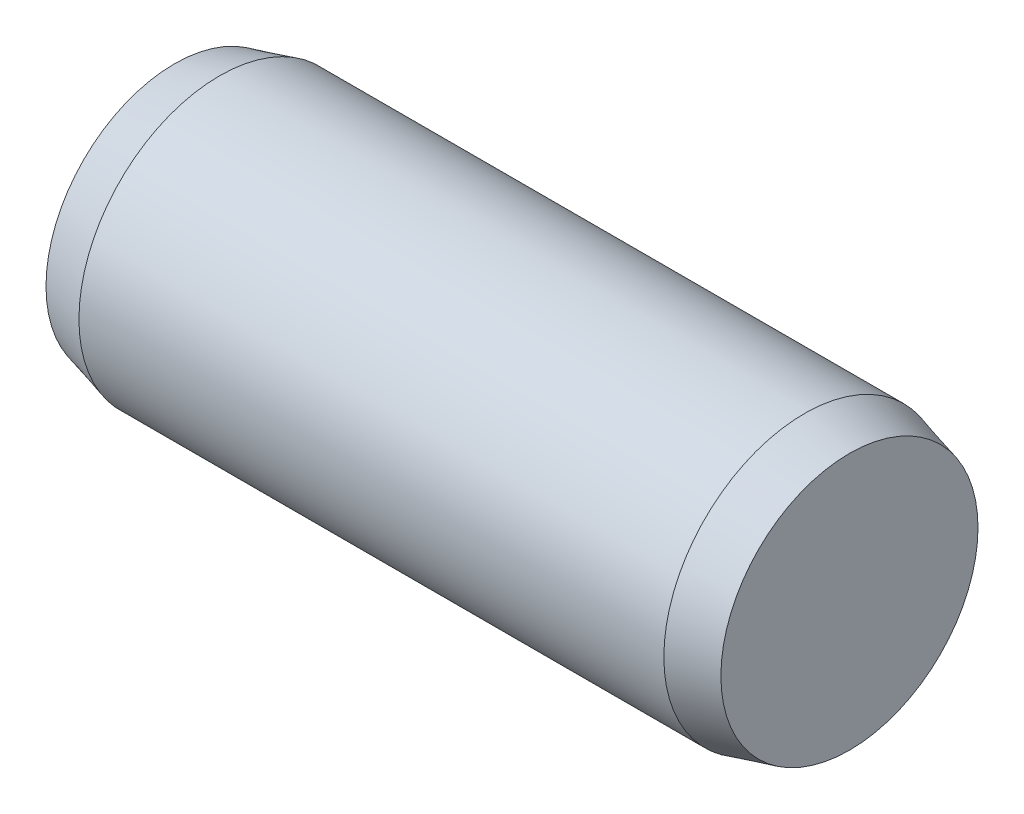
ISO-10303-21;
HEADER;
FILE_DESCRIPTION(('STEP AP214'),'2;1');
FILE_NAME('part.step','',(''),(''),'','','');
FILE_SCHEMA(('AUTOMOTIVE_DESIGN { 1 0 10303 214 1 1 1 1 }'));
ENDSEC;
DATA;
#1=APPLICATION_CONTEXT('core data for automotive mechanical design processes');
#2=APPLICATION_PROTOCOL_DEFINITION('international standard','automotive_design',2000,#1);
#3=PRODUCT_CONTEXT('',#1,'mechanical');
#4=PRODUCT('Part','Part','',(#3));
#5=PRODUCT_RELATED_PRODUCT_CATEGORY('part','',(#4));
#6=PRODUCT_DEFINITION_FORMATION('','',#4);
#7=PRODUCT_DEFINITION_CONTEXT('part definition',#1,'design');
#8=PRODUCT_DEFINITION('design','',#6,#7);
#9=PRODUCT_DEFINITION_SHAPE('','',#8);
#10=(LENGTH_UNIT() NAMED_UNIT(*) SI_UNIT(.MILLI.,.METRE.));
#11=(NAMED_UNIT(*) PLANE_ANGLE_UNIT() SI_UNIT($,.RADIAN.));
#12=(NAMED_UNIT(*) SI_UNIT($,.STERADIAN.) SOLID_ANGLE_UNIT());
#13=UNCERTAINTY_MEASURE_WITH_UNIT(LENGTH_MEASURE(1.E-05),#10,'distance_accuracy_value','');
#14=(GEOMETRIC_REPRESENTATION_CONTEXT(3) GLOBAL_UNCERTAINTY_ASSIGNED_CONTEXT((#13)) GLOBAL_UNIT_ASSIGNED_CONTEXT((#10,
#11,#12)) REPRESENTATION_CONTEXT('',''));
#15=CARTESIAN_POINT('',(0.,0.,0.));
#16=DIRECTION('',(0.,0.,1.));
#17=DIRECTION('',(1.,0.,0.));
#18=AXIS2_PLACEMENT_3D('',#15,#16,#17);
#19=CARTESIAN_POINT('',(12.,0.,0.));
#20=DIRECTION('',(-1.,0.,0.));
#21=DIRECTION('',(0.,0.,1.));
#22=AXIS2_PLACEMENT_3D('',#19,#20,#21);
#23=PLANE('',#22);
#24=CARTESIAN_POINT('',(12.0000000000005,0.,0.));
#25=DIRECTION('',(-1.,0.,0.));
#26=DIRECTION('',(0.,0.,1.));
#27=AXIS2_PLACEMENT_3D('',#24,#25,#26);
#28=CIRCLE('',#27,2.28564064605052);
#29=CARTESIAN_POINT('',(12.0000000000005,0.,2.28564064605052));
#30=VERTEX_POINT('',#29);
#31=EDGE_CURVE('E17',#30,#30,#28,.T.);
#32=ORIENTED_EDGE('',*,*,#31,.F.);
#33=EDGE_LOOP('',(#32));
#34=FACE_BOUND('',#33,.T.);
#35=ADVANCED_FACE('F14',(#34),#23,.F.);
#36=CARTESIAN_POINT('',(0.,2.2856406460551,0.));
#37=DIRECTION('',(1.,0.,0.));
#38=DIRECTION('',(0.,0.,-1.));
#39=AXIS2_PLACEMENT_3D('',#36,#37,#38);
#40=PLANE('',#39);
#41=CARTESIAN_POINT('',(5.6843418860808E-11,0.,0.));
#42=DIRECTION('',(1.,0.,0.));
#43=DIRECTION('',(0.,0.,-1.));
#44=AXIS2_PLACEMENT_3D('',#41,#42,#43);
#45=CIRCLE('',#44,2.28564064608303);
#46=CARTESIAN_POINT('',(5.6843418860808E-11,0.,-2.28564064608303));
#47=VERTEX_POINT('',#46);
#48=EDGE_CURVE('E26',#47,#47,#45,.T.);
#49=ORIENTED_EDGE('',*,*,#48,.F.);
#50=EDGE_LOOP('',(#49));
#51=FACE_BOUND('',#50,.T.);
#52=ADVANCED_FACE('F37',(#51),#40,.F.);
#53=CARTESIAN_POINT('',(11.2000000001444,0.,0.));
#54=DIRECTION('',(-1.,0.,0.));
#55=DIRECTION('',(0.,0.,1.));
#56=AXIS2_PLACEMENT_3D('',#53,#54,#55);
#57=CONICAL_SURFACE('',#56,2.4999999999693,0.261799387813681);
#58=CARTESIAN_POINT('',(11.2,0.,0.));
#59=DIRECTION('',(-1.,0.,0.));
#60=DIRECTION('',(0.,0.,1.));
#61=AXIS2_PLACEMENT_3D('',#58,#59,#60);
#62=CIRCLE('',#61,2.5);
#63=CARTESIAN_POINT('',(11.2,0.,2.5));
#64=VERTEX_POINT('',#63);
#65=EDGE_CURVE('E21',#64,#64,#62,.T.);
#66=ORIENTED_EDGE('',*,*,#65,.F.);
#67=EDGE_LOOP('',(#66));
#68=FACE_BOUND('',#67,.T.);
#69=ORIENTED_EDGE('',*,*,#31,.T.);
#70=EDGE_LOOP('',(#69));
#71=FACE_BOUND('',#70,.T.);
#72=ADVANCED_FACE('F34',(#68,#71),#57,.T.);
#73=CARTESIAN_POINT('',(0.79999999991287,0.,0.));
#74=DIRECTION('',(1.,0.,0.));
#75=DIRECTION('',(0.,0.,-1.));
#76=AXIS2_PLACEMENT_3D('',#73,#74,#75);
#77=CONICAL_SURFACE('',#76,2.4999999999693,0.261799387775774);
#78=CARTESIAN_POINT('',(0.8,0.,0.));
#79=DIRECTION('',(-1.,0.,0.));
#80=DIRECTION('',(0.,0.,1.));
#81=AXIS2_PLACEMENT_3D('',#78,#79,#80);
#82=CIRCLE('',#81,2.5);
#83=CARTESIAN_POINT('',(0.8,0.,2.5));
#84=VERTEX_POINT('',#83);
#85=EDGE_CURVE('E10',#84,#84,#82,.F.);
#86=ORIENTED_EDGE('',*,*,#85,.F.);
#87=EDGE_LOOP('',(#86));
#88=FACE_BOUND('',#87,.T.);
#89=ORIENTED_EDGE('',*,*,#48,.T.);
#90=EDGE_LOOP('',(#89));
#91=FACE_BOUND('',#90,.T.);
#92=ADVANCED_FACE('F45',(#88,#91),#77,.T.);
#93=CARTESIAN_POINT('',(-6.35,0.,0.));
#94=DIRECTION('',(-1.,0.,0.));
#95=DIRECTION('',(0.,0.,1.));
#96=AXIS2_PLACEMENT_3D('',#93,#94,#95);
#97=CYLINDRICAL_SURFACE('',#96,2.5);
#98=ORIENTED_EDGE('',*,*,#85,.T.);
#99=EDGE_LOOP('',(#98));
#100=FACE_BOUND('',#99,.T.);
#101=ORIENTED_EDGE('',*,*,#65,.T.);
#102=EDGE_LOOP('',(#101));
#103=FACE_BOUND('',#102,.T.);
#104=ADVANCED_FACE('F43',(#100,#103),#97,.T.);
#105=CLOSED_SHELL('',(#35,#52,#72,#92,#104));
#106=MANIFOLD_SOLID_BREP('B1',#105);
#107=ADVANCED_BREP_SHAPE_REPRESENTATION('',(#18,#106),#14);
#108=SHAPE_DEFINITION_REPRESENTATION(#9,#107);
ENDSEC;
END-ISO-10303-21;
